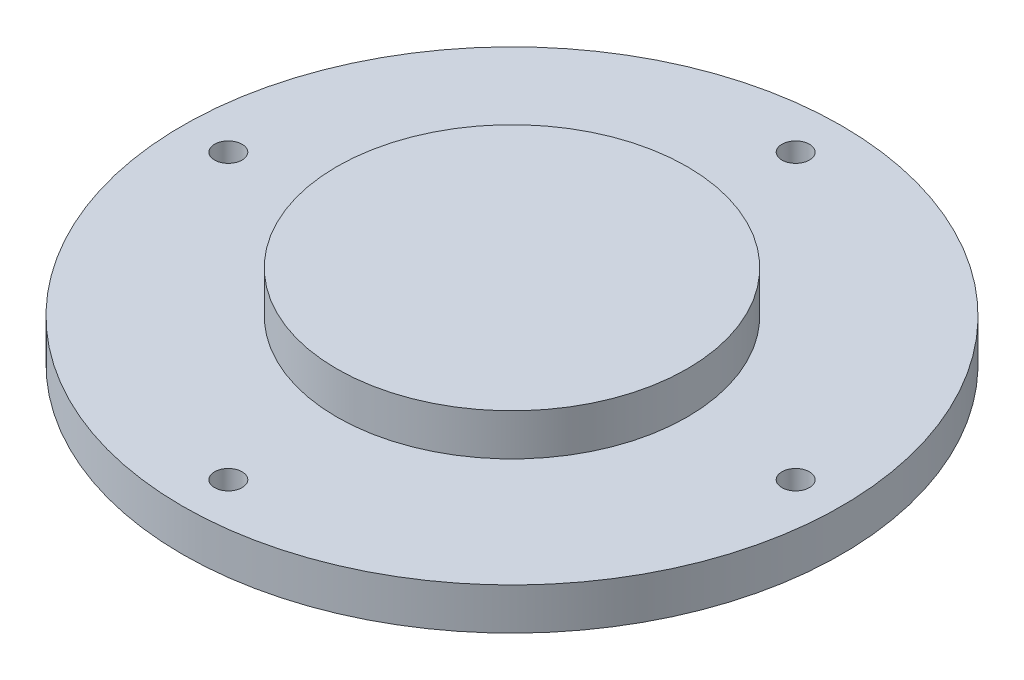
ISO-10303-21;
HEADER;
FILE_DESCRIPTION(('STEP AP214'),'2;1');
FILE_NAME('part.step','',(''),(''),'','','');
FILE_SCHEMA(('AUTOMOTIVE_DESIGN { 1 0 10303 214 1 1 1 1 }'));
ENDSEC;
DATA;
#1=APPLICATION_CONTEXT('core data for automotive mechanical design processes');
#2=APPLICATION_PROTOCOL_DEFINITION('international standard','automotive_design',2000,#1);
#3=PRODUCT_CONTEXT('',#1,'mechanical');
#4=PRODUCT('Part','Part','',(#3));
#5=PRODUCT_RELATED_PRODUCT_CATEGORY('part','',(#4));
#6=PRODUCT_DEFINITION_FORMATION('','',#4);
#7=PRODUCT_DEFINITION_CONTEXT('part definition',#1,'design');
#8=PRODUCT_DEFINITION('design','',#6,#7);
#9=PRODUCT_DEFINITION_SHAPE('','',#8);
#10=(LENGTH_UNIT() NAMED_UNIT(*) SI_UNIT(.MILLI.,.METRE.));
#11=(NAMED_UNIT(*) PLANE_ANGLE_UNIT() SI_UNIT($,.RADIAN.));
#12=(NAMED_UNIT(*) SI_UNIT($,.STERADIAN.) SOLID_ANGLE_UNIT());
#13=UNCERTAINTY_MEASURE_WITH_UNIT(LENGTH_MEASURE(1.E-05),#10,'distance_accuracy_value','');
#14=(GEOMETRIC_REPRESENTATION_CONTEXT(3) GLOBAL_UNCERTAINTY_ASSIGNED_CONTEXT((#13)) GLOBAL_UNIT_ASSIGNED_CONTEXT((#10,
#11,#12)) REPRESENTATION_CONTEXT('',''));
#15=CARTESIAN_POINT('',(0.,0.,0.));
#16=DIRECTION('',(0.,0.,1.));
#17=DIRECTION('',(1.,0.,0.));
#18=AXIS2_PLACEMENT_3D('',#15,#16,#17);
#19=CARTESIAN_POINT('',(0.,0.,0.));
#20=DIRECTION('',(0.,-1.,0.));
#21=DIRECTION('',(0.,0.,-1.));
#22=AXIS2_PLACEMENT_3D('',#19,#20,#21);
#23=PLANE('',#22);
#24=CARTESIAN_POINT('',(0.,0.,0.));
#25=DIRECTION('',(0.,-1.,0.));
#26=DIRECTION('',(0.,0.,-1.));
#27=AXIS2_PLACEMENT_3D('',#24,#25,#26);
#28=CIRCLE('',#27,22.5);
#29=CARTESIAN_POINT('',(0.,0.,-22.5));
#30=VERTEX_POINT('',#29);
#31=EDGE_CURVE('E80',#30,#30,#28,.T.);
#32=ORIENTED_EDGE('',*,*,#31,.F.);
#33=EDGE_LOOP('',(#32));
#34=FACE_BOUND('',#33,.T.);
#35=CARTESIAN_POINT('',(0.,0.,0.));
#36=DIRECTION('',(0.,-1.,0.));
#37=DIRECTION('',(0.,0.,-1.));
#38=AXIS2_PLACEMENT_3D('',#35,#36,#37);
#39=CIRCLE('',#38,25.5);
#40=CARTESIAN_POINT('',(0.,0.,-25.5));
#41=VERTEX_POINT('',#40);
#42=EDGE_CURVE('E74',#41,#41,#39,.T.);
#43=ORIENTED_EDGE('',*,*,#42,.T.);
#44=EDGE_LOOP('',(#43));
#45=FACE_BOUND('',#44,.T.);
#46=ADVANCED_FACE('F41',(#34,#45),#23,.T.);
#47=CARTESIAN_POINT('',(0.,2.45,0.));
#48=DIRECTION('',(0.,-1.,0.));
#49=DIRECTION('',(0.,0.,-1.));
#50=AXIS2_PLACEMENT_3D('',#47,#48,#49);
#51=CYLINDRICAL_SURFACE('',#50,28.);
#52=CARTESIAN_POINT('',(0.,2.45,0.));
#53=DIRECTION('',(0.,-1.,0.));
#54=DIRECTION('',(0.,0.,-1.));
#55=AXIS2_PLACEMENT_3D('',#52,#53,#54);
#56=CIRCLE('',#55,28.);
#57=CARTESIAN_POINT('',(0.,2.45,-28.));
#58=VERTEX_POINT('',#57);
#59=EDGE_CURVE('E67',#58,#58,#56,.T.);
#60=ORIENTED_EDGE('',*,*,#59,.F.);
#61=EDGE_LOOP('',(#60));
#62=FACE_BOUND('',#61,.T.);
#63=CARTESIAN_POINT('',(0.,0.,0.));
#64=DIRECTION('',(0.,-1.,0.));
#65=DIRECTION('',(0.,0.,-1.));
#66=AXIS2_PLACEMENT_3D('',#63,#64,#65);
#67=CIRCLE('',#66,28.);
#68=CARTESIAN_POINT('',(0.,0.,-28.));
#69=VERTEX_POINT('',#68);
#70=EDGE_CURVE('E68',#69,#69,#67,.T.);
#71=ORIENTED_EDGE('',*,*,#70,.T.);
#72=EDGE_LOOP('',(#71));
#73=FACE_BOUND('',#72,.T.);
#74=ADVANCED_FACE('F146',(#62,#73),#51,.F.);
#75=CARTESIAN_POINT('',(0.,2.45,0.));
#76=DIRECTION('',(0.,-1.,0.));
#77=DIRECTION('',(0.,0.,-1.));
#78=AXIS2_PLACEMENT_3D('',#75,#76,#77);
#79=PLANE('',#78);
#80=CARTESIAN_POINT('',(0.,2.45,0.));
#81=DIRECTION('',(0.,-1.,0.));
#82=DIRECTION('',(0.,0.,-1.));
#83=AXIS2_PLACEMENT_3D('',#80,#81,#82);
#84=CIRCLE('',#83,25.5);
#85=CARTESIAN_POINT('',(0.,2.45,-25.5));
#86=VERTEX_POINT('',#85);
#87=EDGE_CURVE('E71',#86,#86,#84,.T.);
#88=ORIENTED_EDGE('',*,*,#87,.F.);
#89=EDGE_LOOP('',(#88));
#90=FACE_BOUND('',#89,.T.);
#91=ORIENTED_EDGE('',*,*,#59,.T.);
#92=EDGE_LOOP('',(#91));
#93=FACE_BOUND('',#92,.T.);
#94=ADVANCED_FACE('F151',(#90,#93),#79,.T.);
#95=CARTESIAN_POINT('',(0.,2.45,0.));
#96=DIRECTION('',(0.,-1.,0.));
#97=DIRECTION('',(0.,0.,-1.));
#98=AXIS2_PLACEMENT_3D('',#95,#96,#97);
#99=CYLINDRICAL_SURFACE('',#98,25.5);
#100=ORIENTED_EDGE('',*,*,#87,.T.);
#101=EDGE_LOOP('',(#100));
#102=FACE_BOUND('',#101,.T.);
#103=ORIENTED_EDGE('',*,*,#42,.F.);
#104=EDGE_LOOP('',(#103));
#105=FACE_BOUND('',#104,.T.);
#106=ADVANCED_FACE('F188',(#102,#105),#99,.T.);
#107=CARTESIAN_POINT('',(0.,9.99999999999998,0.));
#108=DIRECTION('',(0.,1.,0.));
#109=DIRECTION('',(0.,0.,1.));
#110=AXIS2_PLACEMENT_3D('',#107,#108,#109);
#111=PLANE('',#110);
#112=CARTESIAN_POINT('',(0.,9.99999999999999,0.));
#113=DIRECTION('',(0.,-1.,0.));
#114=DIRECTION('',(0.,0.,-1.));
#115=AXIS2_PLACEMENT_3D('',#112,#113,#114);
#116=CIRCLE('',#115,21.);
#117=CARTESIAN_POINT('',(0.,9.99999999999999,-21.));
#118=VERTEX_POINT('',#117);
#119=EDGE_CURVE('E48',#118,#118,#116,.T.);
#120=ORIENTED_EDGE('',*,*,#119,.F.);
#121=EDGE_LOOP('',(#120));
#122=FACE_BOUND('',#121,.T.);
#123=ADVANCED_FACE('F191',(#122),#111,.T.);
#124=CARTESIAN_POINT('',(0.,0.,0.));
#125=DIRECTION('',(0.,-1.,0.));
#126=DIRECTION('',(0.,0.,-1.));
#127=AXIS2_PLACEMENT_3D('',#124,#125,#126);
#128=CYLINDRICAL_SURFACE('',#127,21.);
#129=ORIENTED_EDGE('',*,*,#119,.T.);
#130=EDGE_LOOP('',(#129));
#131=FACE_BOUND('',#130,.T.);
#132=CARTESIAN_POINT('',(0.,4.99999999999999,0.));
#133=DIRECTION('',(0.,-1.,0.));
#134=DIRECTION('',(0.,0.,-1.));
#135=AXIS2_PLACEMENT_3D('',#132,#133,#134);
#136=CIRCLE('',#135,21.);
#137=CARTESIAN_POINT('',(0.,4.99999999999999,-21.));
#138=VERTEX_POINT('',#137);
#139=EDGE_CURVE('E52',#138,#138,#136,.T.);
#140=ORIENTED_EDGE('',*,*,#139,.F.);
#141=EDGE_LOOP('',(#140));
#142=FACE_BOUND('',#141,.T.);
#143=ADVANCED_FACE('F142',(#131,#142),#128,.T.);
#144=CARTESIAN_POINT('',(0.,5.,0.));
#145=DIRECTION('',(0.,1.,0.));
#146=DIRECTION('',(0.,0.,1.));
#147=AXIS2_PLACEMENT_3D('',#144,#145,#146);
#148=PLANE('',#147);
#149=CARTESIAN_POINT('',(34.,5.,3.56131096562E-13));
#150=DIRECTION('',(0.,1.,0.));
#151=DIRECTION('',(0.,0.,1.));
#152=AXIS2_PLACEMENT_3D('',#149,#150,#151);
#153=CIRCLE('',#152,1.65);
#154=CARTESIAN_POINT('',(34.,5.,1.65000000000035));
#155=VERTEX_POINT('',#154);
#156=EDGE_CURVE('E109',#155,#155,#153,.T.);
#157=ORIENTED_EDGE('',*,*,#156,.F.);
#158=EDGE_LOOP('',(#157));
#159=FACE_BOUND('',#158,.T.);
#160=CARTESIAN_POINT('',(0.,5.,-34.));
#161=DIRECTION('',(0.,1.,0.));
#162=DIRECTION('',(0.,0.,1.));
#163=AXIS2_PLACEMENT_3D('',#160,#161,#162);
#164=CIRCLE('',#163,1.65);
#165=CARTESIAN_POINT('',(0.,5.,-32.35));
#166=VERTEX_POINT('',#165);
#167=EDGE_CURVE('E103',#166,#166,#164,.T.);
#168=ORIENTED_EDGE('',*,*,#167,.F.);
#169=EDGE_LOOP('',(#168));
#170=FACE_BOUND('',#169,.T.);
#171=CARTESIAN_POINT('',(-34.,5.,-1.18710365520667E-13));
#172=DIRECTION('',(0.,1.,0.));
#173=DIRECTION('',(0.,0.,1.));
#174=AXIS2_PLACEMENT_3D('',#171,#172,#173);
#175=CIRCLE('',#174,1.65);
#176=CARTESIAN_POINT('',(-34.,5.,1.64999999999988));
#177=VERTEX_POINT('',#176);
#178=EDGE_CURVE('E97',#177,#177,#175,.T.);
#179=ORIENTED_EDGE('',*,*,#178,.F.);
#180=EDGE_LOOP('',(#179));
#181=FACE_BOUND('',#180,.T.);
#182=CARTESIAN_POINT('',(0.,5.,34.));
#183=DIRECTION('',(0.,1.,0.));
#184=DIRECTION('',(0.,0.,1.));
#185=AXIS2_PLACEMENT_3D('',#182,#183,#184);
#186=CIRCLE('',#185,1.65);
#187=CARTESIAN_POINT('',(0.,5.,35.65));
#188=VERTEX_POINT('',#187);
#189=EDGE_CURVE('E89',#188,#188,#186,.T.);
#190=ORIENTED_EDGE('',*,*,#189,.F.);
#191=EDGE_LOOP('',(#190));
#192=FACE_BOUND('',#191,.T.);
#193=ORIENTED_EDGE('',*,*,#139,.T.);
#194=EDGE_LOOP('',(#193));
#195=FACE_BOUND('',#194,.T.);
#196=CARTESIAN_POINT('',(0.,5.00000000000001,0.));
#197=DIRECTION('',(0.,-1.,0.));
#198=DIRECTION('',(0.,0.,-1.));
#199=AXIS2_PLACEMENT_3D('',#196,#197,#198);
#200=CIRCLE('',#199,39.5);
#201=CARTESIAN_POINT('',(0.,5.00000000000001,-39.5));
#202=VERTEX_POINT('',#201);
#203=EDGE_CURVE('E56',#202,#202,#200,.T.);
#204=ORIENTED_EDGE('',*,*,#203,.F.);
#205=EDGE_LOOP('',(#204));
#206=FACE_BOUND('',#205,.T.);
#207=ADVANCED_FACE('F136',(#159,#170,#181,#192,#195,#206),#148,.T.);
#208=CARTESIAN_POINT('',(0.,0.,0.));
#209=DIRECTION('',(0.,-1.,0.));
#210=DIRECTION('',(0.,0.,-1.));
#211=AXIS2_PLACEMENT_3D('',#208,#209,#210);
#212=CYLINDRICAL_SURFACE('',#211,39.5);
#213=ORIENTED_EDGE('',*,*,#203,.T.);
#214=EDGE_LOOP('',(#213));
#215=FACE_BOUND('',#214,.T.);
#216=CARTESIAN_POINT('',(0.,0.,0.));
#217=DIRECTION('',(0.,-1.,0.));
#218=DIRECTION('',(0.,0.,-1.));
#219=AXIS2_PLACEMENT_3D('',#216,#217,#218);
#220=CIRCLE('',#219,39.5);
#221=CARTESIAN_POINT('',(0.,0.,-39.5));
#222=VERTEX_POINT('',#221);
#223=EDGE_CURVE('E61',#222,#222,#220,.T.);
#224=ORIENTED_EDGE('',*,*,#223,.F.);
#225=EDGE_LOOP('',(#224));
#226=FACE_BOUND('',#225,.T.);
#227=ADVANCED_FACE('F122',(#215,#226),#212,.T.);
#228=CARTESIAN_POINT('',(34.,0.,3.56131096562E-13));
#229=DIRECTION('',(0.,-1.,0.));
#230=DIRECTION('',(0.,0.,-1.));
#231=AXIS2_PLACEMENT_3D('',#228,#229,#230);
#232=CIRCLE('',#231,1.65);
#233=CARTESIAN_POINT('',(34.,0.,-1.64999999999964));
#234=VERTEX_POINT('',#233);
#235=EDGE_CURVE('E112',#234,#234,#232,.T.);
#236=ORIENTED_EDGE('',*,*,#235,.F.);
#237=EDGE_LOOP('',(#236));
#238=FACE_BOUND('',#237,.T.);
#239=CARTESIAN_POINT('',(0.,0.,-34.));
#240=DIRECTION('',(0.,-1.,0.));
#241=DIRECTION('',(0.,0.,-1.));
#242=AXIS2_PLACEMENT_3D('',#239,#240,#241);
#243=CIRCLE('',#242,1.65);
#244=CARTESIAN_POINT('',(0.,0.,-35.65));
#245=VERTEX_POINT('',#244);
#246=EDGE_CURVE('E106',#245,#245,#243,.T.);
#247=ORIENTED_EDGE('',*,*,#246,.F.);
#248=EDGE_LOOP('',(#247));
#249=FACE_BOUND('',#248,.T.);
#250=CARTESIAN_POINT('',(-34.,0.,-1.18710365520667E-13));
#251=DIRECTION('',(0.,-1.,0.));
#252=DIRECTION('',(0.,0.,-1.));
#253=AXIS2_PLACEMENT_3D('',#250,#251,#252);
#254=CIRCLE('',#253,1.65);
#255=CARTESIAN_POINT('',(-34.,0.,-1.65000000000012));
#256=VERTEX_POINT('',#255);
#257=EDGE_CURVE('E100',#256,#256,#254,.T.);
#258=ORIENTED_EDGE('',*,*,#257,.F.);
#259=EDGE_LOOP('',(#258));
#260=FACE_BOUND('',#259,.T.);
#261=CARTESIAN_POINT('',(0.,0.,34.));
#262=DIRECTION('',(0.,-1.,0.));
#263=DIRECTION('',(0.,0.,-1.));
#264=AXIS2_PLACEMENT_3D('',#261,#262,#263);
#265=CIRCLE('',#264,1.65);
#266=CARTESIAN_POINT('',(0.,0.,32.35));
#267=VERTEX_POINT('',#266);
#268=EDGE_CURVE('E94',#267,#267,#265,.T.);
#269=ORIENTED_EDGE('',*,*,#268,.F.);
#270=EDGE_LOOP('',(#269));
#271=FACE_BOUND('',#270,.T.);
#272=ORIENTED_EDGE('',*,*,#70,.F.);
#273=EDGE_LOOP('',(#272));
#274=FACE_BOUND('',#273,.T.);
#275=ORIENTED_EDGE('',*,*,#223,.T.);
#276=EDGE_LOOP('',(#275));
#277=FACE_BOUND('',#276,.T.);
#278=ADVANCED_FACE('F118',(#238,#249,#260,#271,#274,#277),#23,.T.);
#279=CARTESIAN_POINT('',(0.,1.68,0.));
#280=DIRECTION('',(0.,-1.,0.));
#281=DIRECTION('',(0.,0.,-1.));
#282=AXIS2_PLACEMENT_3D('',#279,#280,#281);
#283=CYLINDRICAL_SURFACE('',#282,22.5);
#284=CARTESIAN_POINT('',(0.,1.68,0.));
#285=DIRECTION('',(0.,-1.,0.));
#286=DIRECTION('',(0.,0.,-1.));
#287=AXIS2_PLACEMENT_3D('',#284,#285,#286);
#288=CIRCLE('',#287,22.5);
#289=CARTESIAN_POINT('',(0.,1.68,-22.5));
#290=VERTEX_POINT('',#289);
#291=EDGE_CURVE('E77',#290,#290,#288,.T.);
#292=ORIENTED_EDGE('',*,*,#291,.F.);
#293=EDGE_LOOP('',(#292));
#294=FACE_BOUND('',#293,.T.);
#295=ORIENTED_EDGE('',*,*,#31,.T.);
#296=EDGE_LOOP('',(#295));
#297=FACE_BOUND('',#296,.T.);
#298=ADVANCED_FACE('F121',(#294,#297),#283,.F.);
#299=CARTESIAN_POINT('',(0.,1.68,0.));
#300=DIRECTION('',(0.,-1.,0.));
#301=DIRECTION('',(0.,0.,-1.));
#302=AXIS2_PLACEMENT_3D('',#299,#300,#301);
#303=PLANE('',#302);
#304=CARTESIAN_POINT('',(0.,1.68,0.));
#305=DIRECTION('',(0.,-1.,0.));
#306=DIRECTION('',(0.,0.,-1.));
#307=AXIS2_PLACEMENT_3D('',#304,#305,#306);
#308=CIRCLE('',#307,19.5);
#309=CARTESIAN_POINT('',(0.,1.68,-19.5));
#310=VERTEX_POINT('',#309);
#311=EDGE_CURVE('E83',#310,#310,#308,.T.);
#312=ORIENTED_EDGE('',*,*,#311,.F.);
#313=EDGE_LOOP('',(#312));
#314=FACE_BOUND('',#313,.T.);
#315=ORIENTED_EDGE('',*,*,#291,.T.);
#316=EDGE_LOOP('',(#315));
#317=FACE_BOUND('',#316,.T.);
#318=ADVANCED_FACE('F175',(#314,#317),#303,.T.);
#319=CARTESIAN_POINT('',(0.,1.68,0.));
#320=DIRECTION('',(0.,-1.,0.));
#321=DIRECTION('',(0.,0.,-1.));
#322=AXIS2_PLACEMENT_3D('',#319,#320,#321);
#323=CYLINDRICAL_SURFACE('',#322,19.5);
#324=ORIENTED_EDGE('',*,*,#311,.T.);
#325=EDGE_LOOP('',(#324));
#326=FACE_BOUND('',#325,.T.);
#327=CARTESIAN_POINT('',(0.,0.,0.));
#328=DIRECTION('',(0.,-1.,0.));
#329=DIRECTION('',(0.,0.,-1.));
#330=AXIS2_PLACEMENT_3D('',#327,#328,#329);
#331=CIRCLE('',#330,19.5);
#332=CARTESIAN_POINT('',(0.,0.,-19.5));
#333=VERTEX_POINT('',#332);
#334=EDGE_CURVE('E86',#333,#333,#331,.T.);
#335=ORIENTED_EDGE('',*,*,#334,.F.);
#336=EDGE_LOOP('',(#335));
#337=FACE_BOUND('',#336,.T.);
#338=ADVANCED_FACE('F173',(#326,#337),#323,.T.);
#339=CARTESIAN_POINT('',(0.,5.,0.));
#340=DIRECTION('',(0.,1.,0.));
#341=DIRECTION('',(0.,0.,1.));
#342=AXIS2_PLACEMENT_3D('',#339,#340,#341);
#343=PLANE('',#342);
#344=CARTESIAN_POINT('',(0.,5.,0.));
#345=DIRECTION('',(0.,-1.,0.));
#346=DIRECTION('',(0.,0.,-1.));
#347=AXIS2_PLACEMENT_3D('',#344,#345,#346);
#348=CIRCLE('',#347,16.);
#349=CARTESIAN_POINT('',(0.,5.,-16.));
#350=VERTEX_POINT('',#349);
#351=EDGE_CURVE('E11',#350,#350,#348,.T.);
#352=ORIENTED_EDGE('',*,*,#351,.T.);
#353=EDGE_LOOP('',(#352));
#354=FACE_BOUND('',#353,.T.);
#355=ADVANCED_FACE('F167',(#354),#343,.F.);
#356=CARTESIAN_POINT('',(0.,0.,0.));
#357=DIRECTION('',(0.,-1.,0.));
#358=DIRECTION('',(0.,0.,-1.));
#359=AXIS2_PLACEMENT_3D('',#356,#357,#358);
#360=CYLINDRICAL_SURFACE('',#359,16.);
#361=ORIENTED_EDGE('',*,*,#351,.F.);
#362=EDGE_LOOP('',(#361));
#363=FACE_BOUND('',#362,.T.);
#364=CARTESIAN_POINT('',(0.,0.,0.));
#365=DIRECTION('',(0.,-1.,0.));
#366=DIRECTION('',(0.,0.,-1.));
#367=AXIS2_PLACEMENT_3D('',#364,#365,#366);
#368=CIRCLE('',#367,16.);
#369=CARTESIAN_POINT('',(0.,0.,-16.));
#370=VERTEX_POINT('',#369);
#371=EDGE_CURVE('E64',#370,#370,#368,.T.);
#372=ORIENTED_EDGE('',*,*,#371,.T.);
#373=EDGE_LOOP('',(#372));
#374=FACE_BOUND('',#373,.T.);
#375=ADVANCED_FACE('F43',(#363,#374),#360,.F.);
#376=ORIENTED_EDGE('',*,*,#371,.F.);
#377=EDGE_LOOP('',(#376));
#378=FACE_BOUND('',#377,.T.);
#379=ORIENTED_EDGE('',*,*,#334,.T.);
#380=EDGE_LOOP('',(#379));
#381=FACE_BOUND('',#380,.T.);
#382=ADVANCED_FACE('F124',(#378,#381),#23,.T.);
#383=CARTESIAN_POINT('',(0.,0.,34.));
#384=DIRECTION('',(0.,-1.,0.));
#385=DIRECTION('',(0.,0.,-1.));
#386=AXIS2_PLACEMENT_3D('',#383,#384,#385);
#387=CYLINDRICAL_SURFACE('',#386,1.65);
#388=ORIENTED_EDGE('',*,*,#189,.T.);
#389=EDGE_LOOP('',(#388));
#390=FACE_BOUND('',#389,.T.);
#391=ORIENTED_EDGE('',*,*,#268,.T.);
#392=EDGE_LOOP('',(#391));
#393=FACE_BOUND('',#392,.T.);
#394=ADVANCED_FACE('F158',(#390,#393),#387,.F.);
#395=CARTESIAN_POINT('',(-34.,0.,-1.18710365520667E-13));
#396=DIRECTION('',(0.,-1.,0.));
#397=DIRECTION('',(0.,0.,-1.));
#398=AXIS2_PLACEMENT_3D('',#395,#396,#397);
#399=CYLINDRICAL_SURFACE('',#398,1.65);
#400=ORIENTED_EDGE('',*,*,#178,.T.);
#401=EDGE_LOOP('',(#400));
#402=FACE_BOUND('',#401,.T.);
#403=ORIENTED_EDGE('',*,*,#257,.T.);
#404=EDGE_LOOP('',(#403));
#405=FACE_BOUND('',#404,.T.);
#406=ADVANCED_FACE('F164',(#402,#405),#399,.F.);
#407=CARTESIAN_POINT('',(0.,0.,-34.));
#408=DIRECTION('',(0.,-1.,0.));
#409=DIRECTION('',(0.,0.,-1.));
#410=AXIS2_PLACEMENT_3D('',#407,#408,#409);
#411=CYLINDRICAL_SURFACE('',#410,1.65);
#412=ORIENTED_EDGE('',*,*,#167,.T.);
#413=EDGE_LOOP('',(#412));
#414=FACE_BOUND('',#413,.T.);
#415=ORIENTED_EDGE('',*,*,#246,.T.);
#416=EDGE_LOOP('',(#415));
#417=FACE_BOUND('',#416,.T.);
#418=ADVANCED_FACE('F250',(#414,#417),#411,.F.);
#419=CARTESIAN_POINT('',(34.,0.,3.56131096562E-13));
#420=DIRECTION('',(0.,-1.,0.));
#421=DIRECTION('',(0.,0.,-1.));
#422=AXIS2_PLACEMENT_3D('',#419,#420,#421);
#423=CYLINDRICAL_SURFACE('',#422,1.65);
#424=ORIENTED_EDGE('',*,*,#156,.T.);
#425=EDGE_LOOP('',(#424));
#426=FACE_BOUND('',#425,.T.);
#427=ORIENTED_EDGE('',*,*,#235,.T.);
#428=EDGE_LOOP('',(#427));
#429=FACE_BOUND('',#428,.T.);
#430=ADVANCED_FACE('F116',(#426,#429),#423,.F.);
#431=CLOSED_SHELL('',(#46,#74,#94,#106,#123,#143,#207,#227,#278,#298,#318,#338,#355,#375,#382,
#394,#406,#418,#430));
#432=MANIFOLD_SOLID_BREP('B2',#431);
#433=ADVANCED_BREP_SHAPE_REPRESENTATION('',(#18,#432),#14);
#434=SHAPE_DEFINITION_REPRESENTATION(#9,#433);
ENDSEC;
END-ISO-10303-21;
